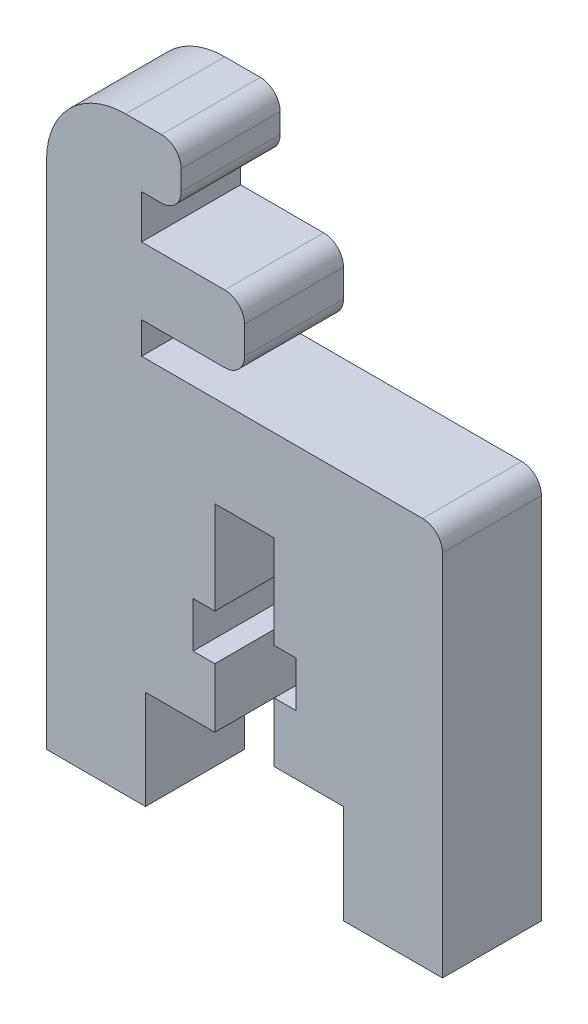
ISO-10303-21;
HEADER;
FILE_DESCRIPTION(('STEP AP214'),'2;1');
FILE_NAME('part.step','',(''),(''),'','','');
FILE_SCHEMA(('AUTOMOTIVE_DESIGN { 1 0 10303 214 1 1 1 1 }'));
ENDSEC;
DATA;
#1=APPLICATION_CONTEXT('core data for automotive mechanical design processes');
#2=APPLICATION_PROTOCOL_DEFINITION('international standard','automotive_design',2000,#1);
#3=PRODUCT_CONTEXT('',#1,'mechanical');
#4=PRODUCT('Part','Part','',(#3));
#5=PRODUCT_RELATED_PRODUCT_CATEGORY('part','',(#4));
#6=PRODUCT_DEFINITION_FORMATION('','',#4);
#7=PRODUCT_DEFINITION_CONTEXT('part definition',#1,'design');
#8=PRODUCT_DEFINITION('design','',#6,#7);
#9=PRODUCT_DEFINITION_SHAPE('','',#8);
#10=(LENGTH_UNIT() NAMED_UNIT(*) SI_UNIT(.MILLI.,.METRE.));
#11=(NAMED_UNIT(*) PLANE_ANGLE_UNIT() SI_UNIT($,.RADIAN.));
#12=(NAMED_UNIT(*) SI_UNIT($,.STERADIAN.) SOLID_ANGLE_UNIT());
#13=UNCERTAINTY_MEASURE_WITH_UNIT(LENGTH_MEASURE(1.E-05),#10,'distance_accuracy_value','');
#14=(GEOMETRIC_REPRESENTATION_CONTEXT(3) GLOBAL_UNCERTAINTY_ASSIGNED_CONTEXT((#13)) GLOBAL_UNIT_ASSIGNED_CONTEXT((#10,
#11,#12)) REPRESENTATION_CONTEXT('',''));
#15=CARTESIAN_POINT('',(0.,0.,0.));
#16=DIRECTION('',(0.,0.,1.));
#17=DIRECTION('',(1.,0.,0.));
#18=AXIS2_PLACEMENT_3D('',#15,#16,#17);
#19=CARTESIAN_POINT('',(5.,0.,5.));
#20=DIRECTION('',(0.,1.,0.));
#21=DIRECTION('',(0.,0.,1.));
#22=AXIS2_PLACEMENT_3D('',#19,#20,#21);
#23=PLANE('',#22);
#24=DIRECTION('',(1.,0.,0.));
#25=VECTOR('',#24,1.);
#26=CARTESIAN_POINT('',(5.,0.,0.));
#27=LINE('',#26,#25);
#28=CARTESIAN_POINT('',(0.,0.,0.));
#29=VERTEX_POINT('',#28);
#30=CARTESIAN_POINT('',(5.,0.,0.));
#31=VERTEX_POINT('',#30);
#32=EDGE_CURVE('E330',#29,#31,#27,.T.);
#33=ORIENTED_EDGE('',*,*,#32,.T.);
#34=DIRECTION('',(0.,0.,-1.));
#35=VECTOR('',#34,1.);
#36=CARTESIAN_POINT('',(5.,0.,5.));
#37=LINE('',#36,#35);
#38=CARTESIAN_POINT('',(5.,0.,5.));
#39=VERTEX_POINT('',#38);
#40=EDGE_CURVE('E269',#39,#31,#37,.T.);
#41=ORIENTED_EDGE('',*,*,#40,.F.);
#42=DIRECTION('',(1.,0.,0.));
#43=VECTOR('',#42,1.);
#44=CARTESIAN_POINT('',(5.,0.,5.));
#45=LINE('',#44,#43);
#46=CARTESIAN_POINT('',(0.,0.,5.));
#47=VERTEX_POINT('',#46);
#48=EDGE_CURVE('E256',#47,#39,#45,.T.);
#49=ORIENTED_EDGE('',*,*,#48,.F.);
#50=DIRECTION('',(0.,0.,-1.));
#51=VECTOR('',#50,1.);
#52=CARTESIAN_POINT('',(0.,0.,5.));
#53=LINE('',#52,#51);
#54=EDGE_CURVE('E267',#47,#29,#53,.T.);
#55=ORIENTED_EDGE('',*,*,#54,.T.);
#56=EDGE_LOOP('',(#33,#41,#49,#55));
#57=FACE_BOUND('',#56,.T.);
#58=ADVANCED_FACE('F33',(#57),#23,.F.);
#59=CARTESIAN_POINT('',(5.,0.,5.));
#60=DIRECTION('',(-1.,0.,0.));
#61=DIRECTION('',(0.,-1.,0.));
#62=AXIS2_PLACEMENT_3D('',#59,#60,#61);
#63=PLANE('',#62);
#64=DIRECTION('',(0.,1.,0.));
#65=VECTOR('',#64,1.);
#66=CARTESIAN_POINT('',(5.,0.,0.));
#67=LINE('',#66,#65);
#68=CARTESIAN_POINT('',(5.,5.,0.));
#69=VERTEX_POINT('',#68);
#70=EDGE_CURVE('E405',#31,#69,#67,.T.);
#71=ORIENTED_EDGE('',*,*,#70,.T.);
#72=DIRECTION('',(0.,0.,-1.));
#73=VECTOR('',#72,1.);
#74=CARTESIAN_POINT('',(5.,5.,5.));
#75=LINE('',#74,#73);
#76=CARTESIAN_POINT('',(5.,5.,5.));
#77=VERTEX_POINT('',#76);
#78=EDGE_CURVE('E280',#77,#69,#75,.T.);
#79=ORIENTED_EDGE('',*,*,#78,.F.);
#80=DIRECTION('',(0.,1.,0.));
#81=VECTOR('',#80,1.);
#82=CARTESIAN_POINT('',(5.,0.,5.));
#83=LINE('',#82,#81);
#84=EDGE_CURVE('E271',#39,#77,#83,.T.);
#85=ORIENTED_EDGE('',*,*,#84,.F.);
#86=ORIENTED_EDGE('',*,*,#40,.T.);
#87=EDGE_LOOP('',(#71,#79,#85,#86));
#88=FACE_BOUND('',#87,.T.);
#89=ADVANCED_FACE('F477',(#88),#63,.F.);
#90=CARTESIAN_POINT('',(8.50000000000001,5.,5.));
#91=DIRECTION('',(0.,1.,0.));
#92=DIRECTION('',(-1.,0.,0.));
#93=AXIS2_PLACEMENT_3D('',#90,#91,#92);
#94=PLANE('',#93);
#95=DIRECTION('',(1.,0.,0.));
#96=VECTOR('',#95,1.);
#97=CARTESIAN_POINT('',(8.50000000000001,5.,0.));
#98=LINE('',#97,#96);
#99=CARTESIAN_POINT('',(8.50000000000001,5.,0.));
#100=VERTEX_POINT('',#99);
#101=EDGE_CURVE('E401',#69,#100,#98,.T.);
#102=ORIENTED_EDGE('',*,*,#101,.T.);
#103=DIRECTION('',(0.,0.,-1.));
#104=VECTOR('',#103,1.);
#105=CARTESIAN_POINT('',(8.50000000000001,5.,5.));
#106=LINE('',#105,#104);
#107=CARTESIAN_POINT('',(8.50000000000001,5.,5.));
#108=VERTEX_POINT('',#107);
#109=EDGE_CURVE('E392',#108,#100,#106,.T.);
#110=ORIENTED_EDGE('',*,*,#109,.F.);
#111=DIRECTION('',(1.,0.,0.));
#112=VECTOR('',#111,1.);
#113=CARTESIAN_POINT('',(8.50000000000001,5.,5.));
#114=LINE('',#113,#112);
#115=EDGE_CURVE('E402',#77,#108,#114,.T.);
#116=ORIENTED_EDGE('',*,*,#115,.F.);
#117=ORIENTED_EDGE('',*,*,#78,.T.);
#118=EDGE_LOOP('',(#102,#110,#116,#117));
#119=FACE_BOUND('',#118,.T.);
#120=ADVANCED_FACE('F399',(#119),#94,.F.);
#121=CARTESIAN_POINT('',(8.5,8.,5.));
#122=DIRECTION('',(-1.,0.,0.));
#123=DIRECTION('',(0.,-1.,0.));
#124=AXIS2_PLACEMENT_3D('',#121,#122,#123);
#125=PLANE('',#124);
#126=DIRECTION('',(0.,1.,0.));
#127=VECTOR('',#126,1.);
#128=CARTESIAN_POINT('',(8.5,8.,0.));
#129=LINE('',#128,#127);
#130=CARTESIAN_POINT('',(8.5,8.,0.));
#131=VERTEX_POINT('',#130);
#132=EDGE_CURVE('E407',#100,#131,#129,.T.);
#133=ORIENTED_EDGE('',*,*,#132,.T.);
#134=DIRECTION('',(0.,0.,-1.));
#135=VECTOR('',#134,1.);
#136=CARTESIAN_POINT('',(8.5,8.,5.));
#137=LINE('',#136,#135);
#138=CARTESIAN_POINT('',(8.5,8.,5.));
#139=VERTEX_POINT('',#138);
#140=EDGE_CURVE('E389',#139,#131,#137,.T.);
#141=ORIENTED_EDGE('',*,*,#140,.F.);
#142=DIRECTION('',(0.,1.,0.));
#143=VECTOR('',#142,1.);
#144=CARTESIAN_POINT('',(8.5,8.,5.));
#145=LINE('',#144,#143);
#146=EDGE_CURVE('E479',#108,#139,#145,.T.);
#147=ORIENTED_EDGE('',*,*,#146,.F.);
#148=ORIENTED_EDGE('',*,*,#109,.T.);
#149=EDGE_LOOP('',(#133,#141,#147,#148));
#150=FACE_BOUND('',#149,.T.);
#151=ADVANCED_FACE('F647',(#150),#125,.F.);
#152=CARTESIAN_POINT('',(8.5,8.,5.));
#153=DIRECTION('',(0.,-1.,0.));
#154=DIRECTION('',(1.,0.,0.));
#155=AXIS2_PLACEMENT_3D('',#152,#153,#154);
#156=PLANE('',#155);
#157=DIRECTION('',(-1.,0.,0.));
#158=VECTOR('',#157,1.);
#159=CARTESIAN_POINT('',(8.5,8.,0.));
#160=LINE('',#159,#158);
#161=CARTESIAN_POINT('',(7.4,8.00000000000001,0.));
#162=VERTEX_POINT('',#161);
#163=EDGE_CURVE('E409',#131,#162,#160,.T.);
#164=ORIENTED_EDGE('',*,*,#163,.T.);
#165=DIRECTION('',(0.,0.,-1.));
#166=VECTOR('',#165,1.);
#167=CARTESIAN_POINT('',(7.4,8.00000000000001,5.));
#168=LINE('',#167,#166);
#169=CARTESIAN_POINT('',(7.4,8.00000000000001,5.));
#170=VERTEX_POINT('',#169);
#171=EDGE_CURVE('E386',#170,#162,#168,.T.);
#172=ORIENTED_EDGE('',*,*,#171,.F.);
#173=DIRECTION('',(-1.,0.,0.));
#174=VECTOR('',#173,1.);
#175=CARTESIAN_POINT('',(8.5,8.,5.));
#176=LINE('',#175,#174);
#177=EDGE_CURVE('E483',#139,#170,#176,.T.);
#178=ORIENTED_EDGE('',*,*,#177,.F.);
#179=ORIENTED_EDGE('',*,*,#140,.T.);
#180=EDGE_LOOP('',(#164,#172,#178,#179));
#181=FACE_BOUND('',#180,.T.);
#182=ADVANCED_FACE('F643',(#181),#156,.F.);
#183=CARTESIAN_POINT('',(7.4,8.00000000000001,5.));
#184=DIRECTION('',(-1.,0.,0.));
#185=DIRECTION('',(0.,-1.,0.));
#186=AXIS2_PLACEMENT_3D('',#183,#184,#185);
#187=PLANE('',#186);
#188=DIRECTION('',(0.,1.,0.));
#189=VECTOR('',#188,1.);
#190=CARTESIAN_POINT('',(7.4,8.00000000000001,0.));
#191=LINE('',#190,#189);
#192=CARTESIAN_POINT('',(7.4,10.3,0.));
#193=VERTEX_POINT('',#192);
#194=EDGE_CURVE('E415',#162,#193,#191,.T.);
#195=ORIENTED_EDGE('',*,*,#194,.T.);
#196=DIRECTION('',(0.,0.,-1.));
#197=VECTOR('',#196,1.);
#198=CARTESIAN_POINT('',(7.4,10.3,5.));
#199=LINE('',#198,#197);
#200=CARTESIAN_POINT('',(7.4,10.3,5.));
#201=VERTEX_POINT('',#200);
#202=EDGE_CURVE('E383',#201,#193,#199,.T.);
#203=ORIENTED_EDGE('',*,*,#202,.F.);
#204=DIRECTION('',(0.,1.,0.));
#205=VECTOR('',#204,1.);
#206=CARTESIAN_POINT('',(7.4,8.00000000000001,5.));
#207=LINE('',#206,#205);
#208=EDGE_CURVE('E485',#170,#201,#207,.T.);
#209=ORIENTED_EDGE('',*,*,#208,.F.);
#210=ORIENTED_EDGE('',*,*,#171,.T.);
#211=EDGE_LOOP('',(#195,#203,#209,#210));
#212=FACE_BOUND('',#211,.T.);
#213=ADVANCED_FACE('F639',(#212),#187,.F.);
#214=CARTESIAN_POINT('',(7.4,10.3,5.));
#215=DIRECTION('',(0.,1.,0.));
#216=DIRECTION('',(-1.,0.,0.));
#217=AXIS2_PLACEMENT_3D('',#214,#215,#216);
#218=PLANE('',#217);
#219=DIRECTION('',(1.,0.,0.));
#220=VECTOR('',#219,1.);
#221=CARTESIAN_POINT('',(7.4,10.3,0.));
#222=LINE('',#221,#220);
#223=CARTESIAN_POINT('',(8.5,10.3,0.));
#224=VERTEX_POINT('',#223);
#225=EDGE_CURVE('E417',#193,#224,#222,.T.);
#226=ORIENTED_EDGE('',*,*,#225,.T.);
#227=DIRECTION('',(0.,0.,-1.));
#228=VECTOR('',#227,1.);
#229=CARTESIAN_POINT('',(8.5,10.3,5.));
#230=LINE('',#229,#228);
#231=CARTESIAN_POINT('',(8.5,10.3,5.));
#232=VERTEX_POINT('',#231);
#233=EDGE_CURVE('E380',#232,#224,#230,.T.);
#234=ORIENTED_EDGE('',*,*,#233,.F.);
#235=DIRECTION('',(1.,0.,0.));
#236=VECTOR('',#235,1.);
#237=CARTESIAN_POINT('',(7.4,10.3,5.));
#238=LINE('',#237,#236);
#239=EDGE_CURVE('E487',#201,#232,#238,.T.);
#240=ORIENTED_EDGE('',*,*,#239,.F.);
#241=ORIENTED_EDGE('',*,*,#202,.T.);
#242=EDGE_LOOP('',(#226,#234,#240,#241));
#243=FACE_BOUND('',#242,.T.);
#244=ADVANCED_FACE('F634',(#243),#218,.F.);
#245=CARTESIAN_POINT('',(8.5,15.,5.));
#246=DIRECTION('',(-1.,0.,0.));
#247=DIRECTION('',(0.,-1.,0.));
#248=AXIS2_PLACEMENT_3D('',#245,#246,#247);
#249=PLANE('',#248);
#250=DIRECTION('',(0.,1.,0.));
#251=VECTOR('',#250,1.);
#252=CARTESIAN_POINT('',(8.5,15.,0.));
#253=LINE('',#252,#251);
#254=CARTESIAN_POINT('',(8.5,15.,0.));
#255=VERTEX_POINT('',#254);
#256=EDGE_CURVE('E419',#224,#255,#253,.T.);
#257=ORIENTED_EDGE('',*,*,#256,.T.);
#258=DIRECTION('',(0.,0.,-1.));
#259=VECTOR('',#258,1.);
#260=CARTESIAN_POINT('',(8.5,15.,5.));
#261=LINE('',#260,#259);
#262=CARTESIAN_POINT('',(8.5,15.,5.));
#263=VERTEX_POINT('',#262);
#264=EDGE_CURVE('E377',#263,#255,#261,.T.);
#265=ORIENTED_EDGE('',*,*,#264,.F.);
#266=DIRECTION('',(0.,1.,0.));
#267=VECTOR('',#266,1.);
#268=CARTESIAN_POINT('',(8.5,15.,5.));
#269=LINE('',#268,#267);
#270=EDGE_CURVE('E489',#232,#263,#269,.T.);
#271=ORIENTED_EDGE('',*,*,#270,.F.);
#272=ORIENTED_EDGE('',*,*,#233,.T.);
#273=EDGE_LOOP('',(#257,#265,#271,#272));
#274=FACE_BOUND('',#273,.T.);
#275=ADVANCED_FACE('F629',(#274),#249,.F.);
#276=CARTESIAN_POINT('',(11.5,15.,5.));
#277=DIRECTION('',(0.,1.,0.));
#278=DIRECTION('',(0.,0.,1.));
#279=AXIS2_PLACEMENT_3D('',#276,#277,#278);
#280=PLANE('',#279);
#281=DIRECTION('',(1.,0.,0.));
#282=VECTOR('',#281,1.);
#283=CARTESIAN_POINT('',(11.5,15.,0.));
#284=LINE('',#283,#282);
#285=CARTESIAN_POINT('',(11.5,15.,0.));
#286=VERTEX_POINT('',#285);
#287=EDGE_CURVE('E421',#255,#286,#284,.T.);
#288=ORIENTED_EDGE('',*,*,#287,.T.);
#289=DIRECTION('',(0.,0.,-1.));
#290=VECTOR('',#289,1.);
#291=CARTESIAN_POINT('',(11.5,15.,5.));
#292=LINE('',#291,#290);
#293=CARTESIAN_POINT('',(11.5,15.,5.));
#294=VERTEX_POINT('',#293);
#295=EDGE_CURVE('E374',#294,#286,#292,.T.);
#296=ORIENTED_EDGE('',*,*,#295,.F.);
#297=DIRECTION('',(1.,0.,0.));
#298=VECTOR('',#297,1.);
#299=CARTESIAN_POINT('',(11.5,15.,5.));
#300=LINE('',#299,#298);
#301=EDGE_CURVE('E491',#263,#294,#300,.T.);
#302=ORIENTED_EDGE('',*,*,#301,.F.);
#303=ORIENTED_EDGE('',*,*,#264,.T.);
#304=EDGE_LOOP('',(#288,#296,#302,#303));
#305=FACE_BOUND('',#304,.T.);
#306=ADVANCED_FACE('F625',(#305),#280,.F.);
#307=CARTESIAN_POINT('',(11.5,10.3,5.));
#308=DIRECTION('',(1.,0.,0.));
#309=DIRECTION('',(0.,0.,-1.));
#310=AXIS2_PLACEMENT_3D('',#307,#308,#309);
#311=PLANE('',#310);
#312=DIRECTION('',(0.,-1.,0.));
#313=VECTOR('',#312,1.);
#314=CARTESIAN_POINT('',(11.5,10.3,0.));
#315=LINE('',#314,#313);
#316=CARTESIAN_POINT('',(11.5,10.3,0.));
#317=VERTEX_POINT('',#316);
#318=EDGE_CURVE('E423',#286,#317,#315,.T.);
#319=ORIENTED_EDGE('',*,*,#318,.T.);
#320=DIRECTION('',(0.,0.,-1.));
#321=VECTOR('',#320,1.);
#322=CARTESIAN_POINT('',(11.5,10.3,5.));
#323=LINE('',#322,#321);
#324=CARTESIAN_POINT('',(11.5,10.3,5.));
#325=VERTEX_POINT('',#324);
#326=EDGE_CURVE('E371',#325,#317,#323,.T.);
#327=ORIENTED_EDGE('',*,*,#326,.F.);
#328=DIRECTION('',(0.,-1.,0.));
#329=VECTOR('',#328,1.);
#330=CARTESIAN_POINT('',(11.5,10.3,5.));
#331=LINE('',#330,#329);
#332=EDGE_CURVE('E493',#294,#325,#331,.T.);
#333=ORIENTED_EDGE('',*,*,#332,.F.);
#334=ORIENTED_EDGE('',*,*,#295,.T.);
#335=EDGE_LOOP('',(#319,#327,#333,#334));
#336=FACE_BOUND('',#335,.T.);
#337=ADVANCED_FACE('F620',(#336),#311,.F.);
#338=CARTESIAN_POINT('',(11.5,10.3,5.));
#339=DIRECTION('',(0.,1.,0.));
#340=DIRECTION('',(-1.,0.,0.));
#341=AXIS2_PLACEMENT_3D('',#338,#339,#340);
#342=PLANE('',#341);
#343=DIRECTION('',(1.,0.,0.));
#344=VECTOR('',#343,1.);
#345=CARTESIAN_POINT('',(11.5,10.3,0.));
#346=LINE('',#345,#344);
#347=CARTESIAN_POINT('',(12.6,10.3,0.));
#348=VERTEX_POINT('',#347);
#349=EDGE_CURVE('E425',#317,#348,#346,.T.);
#350=ORIENTED_EDGE('',*,*,#349,.T.);
#351=DIRECTION('',(0.,0.,-1.));
#352=VECTOR('',#351,1.);
#353=CARTESIAN_POINT('',(12.6,10.3,5.));
#354=LINE('',#353,#352);
#355=CARTESIAN_POINT('',(12.6,10.3,5.));
#356=VERTEX_POINT('',#355);
#357=EDGE_CURVE('E368',#356,#348,#354,.T.);
#358=ORIENTED_EDGE('',*,*,#357,.F.);
#359=DIRECTION('',(1.,0.,0.));
#360=VECTOR('',#359,1.);
#361=CARTESIAN_POINT('',(11.5,10.3,5.));
#362=LINE('',#361,#360);
#363=EDGE_CURVE('E495',#325,#356,#362,.T.);
#364=ORIENTED_EDGE('',*,*,#363,.F.);
#365=ORIENTED_EDGE('',*,*,#326,.T.);
#366=EDGE_LOOP('',(#350,#358,#364,#365));
#367=FACE_BOUND('',#366,.T.);
#368=ADVANCED_FACE('F614',(#367),#342,.F.);
#369=CARTESIAN_POINT('',(12.6,10.3,5.));
#370=DIRECTION('',(1.,0.,0.));
#371=DIRECTION('',(0.,1.,0.));
#372=AXIS2_PLACEMENT_3D('',#369,#370,#371);
#373=PLANE('',#372);
#374=DIRECTION('',(0.,-1.,0.));
#375=VECTOR('',#374,1.);
#376=CARTESIAN_POINT('',(12.6,10.3,0.));
#377=LINE('',#376,#375);
#378=CARTESIAN_POINT('',(12.6,8.,0.));
#379=VERTEX_POINT('',#378);
#380=EDGE_CURVE('E427',#348,#379,#377,.T.);
#381=ORIENTED_EDGE('',*,*,#380,.T.);
#382=DIRECTION('',(0.,0.,-1.));
#383=VECTOR('',#382,1.);
#384=CARTESIAN_POINT('',(12.6,8.,5.));
#385=LINE('',#384,#383);
#386=CARTESIAN_POINT('',(12.6,8.,5.));
#387=VERTEX_POINT('',#386);
#388=EDGE_CURVE('E365',#387,#379,#385,.T.);
#389=ORIENTED_EDGE('',*,*,#388,.F.);
#390=DIRECTION('',(0.,-1.,0.));
#391=VECTOR('',#390,1.);
#392=CARTESIAN_POINT('',(12.6,10.3,5.));
#393=LINE('',#392,#391);
#394=EDGE_CURVE('E497',#356,#387,#393,.T.);
#395=ORIENTED_EDGE('',*,*,#394,.F.);
#396=ORIENTED_EDGE('',*,*,#357,.T.);
#397=EDGE_LOOP('',(#381,#389,#395,#396));
#398=FACE_BOUND('',#397,.T.);
#399=ADVANCED_FACE('F610',(#398),#373,.F.);
#400=CARTESIAN_POINT('',(12.6,8.,5.));
#401=DIRECTION('',(0.,-1.,0.));
#402=DIRECTION('',(0.,0.,-1.));
#403=AXIS2_PLACEMENT_3D('',#400,#401,#402);
#404=PLANE('',#403);
#405=DIRECTION('',(-1.,0.,0.));
#406=VECTOR('',#405,1.);
#407=CARTESIAN_POINT('',(12.6,8.,0.));
#408=LINE('',#407,#406);
#409=CARTESIAN_POINT('',(11.5,8.,0.));
#410=VERTEX_POINT('',#409);
#411=EDGE_CURVE('E429',#379,#410,#408,.T.);
#412=ORIENTED_EDGE('',*,*,#411,.T.);
#413=DIRECTION('',(0.,0.,-1.));
#414=VECTOR('',#413,1.);
#415=CARTESIAN_POINT('',(11.5,8.,5.));
#416=LINE('',#415,#414);
#417=CARTESIAN_POINT('',(11.5,8.,5.));
#418=VERTEX_POINT('',#417);
#419=EDGE_CURVE('E362',#418,#410,#416,.T.);
#420=ORIENTED_EDGE('',*,*,#419,.F.);
#421=DIRECTION('',(-1.,0.,0.));
#422=VECTOR('',#421,1.);
#423=CARTESIAN_POINT('',(12.6,8.,5.));
#424=LINE('',#423,#422);
#425=EDGE_CURVE('E499',#387,#418,#424,.T.);
#426=ORIENTED_EDGE('',*,*,#425,.F.);
#427=ORIENTED_EDGE('',*,*,#388,.T.);
#428=EDGE_LOOP('',(#412,#420,#426,#427));
#429=FACE_BOUND('',#428,.T.);
#430=ADVANCED_FACE('F605',(#429),#404,.F.);
#431=CARTESIAN_POINT('',(11.5,5.,5.));
#432=DIRECTION('',(1.,0.,0.));
#433=DIRECTION('',(0.,1.,0.));
#434=AXIS2_PLACEMENT_3D('',#431,#432,#433);
#435=PLANE('',#434);
#436=DIRECTION('',(0.,-1.,0.));
#437=VECTOR('',#436,1.);
#438=CARTESIAN_POINT('',(11.5,5.,0.));
#439=LINE('',#438,#437);
#440=CARTESIAN_POINT('',(11.5,5.,0.));
#441=VERTEX_POINT('',#440);
#442=EDGE_CURVE('E431',#410,#441,#439,.T.);
#443=ORIENTED_EDGE('',*,*,#442,.T.);
#444=DIRECTION('',(0.,0.,-1.));
#445=VECTOR('',#444,1.);
#446=CARTESIAN_POINT('',(11.5,5.,5.));
#447=LINE('',#446,#445);
#448=CARTESIAN_POINT('',(11.5,5.,5.));
#449=VERTEX_POINT('',#448);
#450=EDGE_CURVE('E359',#449,#441,#447,.T.);
#451=ORIENTED_EDGE('',*,*,#450,.F.);
#452=DIRECTION('',(0.,-1.,0.));
#453=VECTOR('',#452,1.);
#454=CARTESIAN_POINT('',(11.5,5.,5.));
#455=LINE('',#454,#453);
#456=EDGE_CURVE('E501',#418,#449,#455,.T.);
#457=ORIENTED_EDGE('',*,*,#456,.F.);
#458=ORIENTED_EDGE('',*,*,#419,.T.);
#459=EDGE_LOOP('',(#443,#451,#457,#458));
#460=FACE_BOUND('',#459,.T.);
#461=ADVANCED_FACE('F599',(#460),#435,.F.);
#462=CARTESIAN_POINT('',(11.5,5.,5.));
#463=DIRECTION('',(0.,1.,0.));
#464=DIRECTION('',(0.,0.,1.));
#465=AXIS2_PLACEMENT_3D('',#462,#463,#464);
#466=PLANE('',#465);
#467=DIRECTION('',(1.,0.,0.));
#468=VECTOR('',#467,1.);
#469=CARTESIAN_POINT('',(11.5,5.,0.));
#470=LINE('',#469,#468);
#471=CARTESIAN_POINT('',(15.,5.,0.));
#472=VERTEX_POINT('',#471);
#473=EDGE_CURVE('E433',#441,#472,#470,.T.);
#474=ORIENTED_EDGE('',*,*,#473,.T.);
#475=DIRECTION('',(0.,0.,-1.));
#476=VECTOR('',#475,1.);
#477=CARTESIAN_POINT('',(15.,5.,5.));
#478=LINE('',#477,#476);
#479=CARTESIAN_POINT('',(15.,5.,5.));
#480=VERTEX_POINT('',#479);
#481=EDGE_CURVE('E356',#480,#472,#478,.T.);
#482=ORIENTED_EDGE('',*,*,#481,.F.);
#483=DIRECTION('',(1.,0.,0.));
#484=VECTOR('',#483,1.);
#485=CARTESIAN_POINT('',(11.5,5.,5.));
#486=LINE('',#485,#484);
#487=EDGE_CURVE('E503',#449,#480,#486,.T.);
#488=ORIENTED_EDGE('',*,*,#487,.F.);
#489=ORIENTED_EDGE('',*,*,#450,.T.);
#490=EDGE_LOOP('',(#474,#482,#488,#489));
#491=FACE_BOUND('',#490,.T.);
#492=ADVANCED_FACE('F595',(#491),#466,.F.);
#493=CARTESIAN_POINT('',(15.,5.,5.));
#494=DIRECTION('',(1.,0.,0.));
#495=DIRECTION('',(0.,0.,-1.));
#496=AXIS2_PLACEMENT_3D('',#493,#494,#495);
#497=PLANE('',#496);
#498=DIRECTION('',(0.,-1.,0.));
#499=VECTOR('',#498,1.);
#500=CARTESIAN_POINT('',(15.,5.,0.));
#501=LINE('',#500,#499);
#502=CARTESIAN_POINT('',(15.,0.,0.));
#503=VERTEX_POINT('',#502);
#504=EDGE_CURVE('E435',#472,#503,#501,.T.);
#505=ORIENTED_EDGE('',*,*,#504,.T.);
#506=DIRECTION('',(0.,0.,-1.));
#507=VECTOR('',#506,1.);
#508=CARTESIAN_POINT('',(15.,0.,5.));
#509=LINE('',#508,#507);
#510=CARTESIAN_POINT('',(15.,0.,5.));
#511=VERTEX_POINT('',#510);
#512=EDGE_CURVE('E353',#511,#503,#509,.T.);
#513=ORIENTED_EDGE('',*,*,#512,.F.);
#514=DIRECTION('',(0.,-1.,0.));
#515=VECTOR('',#514,1.);
#516=CARTESIAN_POINT('',(15.,5.,5.));
#517=LINE('',#516,#515);
#518=EDGE_CURVE('E505',#480,#511,#517,.T.);
#519=ORIENTED_EDGE('',*,*,#518,.F.);
#520=ORIENTED_EDGE('',*,*,#481,.T.);
#521=EDGE_LOOP('',(#505,#513,#519,#520));
#522=FACE_BOUND('',#521,.T.);
#523=ADVANCED_FACE('F591',(#522),#497,.F.);
#524=CARTESIAN_POINT('',(15.,0.,5.));
#525=DIRECTION('',(0.,1.,0.));
#526=DIRECTION('',(0.,0.,1.));
#527=AXIS2_PLACEMENT_3D('',#524,#525,#526);
#528=PLANE('',#527);
#529=DIRECTION('',(1.,0.,0.));
#530=VECTOR('',#529,1.);
#531=CARTESIAN_POINT('',(15.,0.,0.));
#532=LINE('',#531,#530);
#533=CARTESIAN_POINT('',(20.,0.,0.));
#534=VERTEX_POINT('',#533);
#535=EDGE_CURVE('E437',#503,#534,#532,.T.);
#536=ORIENTED_EDGE('',*,*,#535,.T.);
#537=DIRECTION('',(0.,0.,-1.));
#538=VECTOR('',#537,1.);
#539=CARTESIAN_POINT('',(20.,0.,5.));
#540=LINE('',#539,#538);
#541=CARTESIAN_POINT('',(20.,0.,5.));
#542=VERTEX_POINT('',#541);
#543=EDGE_CURVE('E350',#542,#534,#540,.T.);
#544=ORIENTED_EDGE('',*,*,#543,.F.);
#545=DIRECTION('',(1.,0.,0.));
#546=VECTOR('',#545,1.);
#547=CARTESIAN_POINT('',(15.,0.,5.));
#548=LINE('',#547,#546);
#549=EDGE_CURVE('E507',#511,#542,#548,.T.);
#550=ORIENTED_EDGE('',*,*,#549,.F.);
#551=ORIENTED_EDGE('',*,*,#512,.T.);
#552=EDGE_LOOP('',(#536,#544,#550,#551));
#553=FACE_BOUND('',#552,.T.);
#554=ADVANCED_FACE('F585',(#553),#528,.F.);
#555=CARTESIAN_POINT('',(20.,5.,5.));
#556=DIRECTION('',(-1.,0.,0.));
#557=DIRECTION('',(0.,0.,1.));
#558=AXIS2_PLACEMENT_3D('',#555,#556,#557);
#559=PLANE('',#558);
#560=DIRECTION('',(0.,1.,0.));
#561=VECTOR('',#560,1.);
#562=CARTESIAN_POINT('',(20.,5.,0.));
#563=LINE('',#562,#561);
#564=CARTESIAN_POINT('',(20.,18.6,0.));
#565=VERTEX_POINT('',#564);
#566=EDGE_CURVE('E440',#534,#565,#563,.T.);
#567=ORIENTED_EDGE('',*,*,#566,.T.);
#568=DIRECTION('',(0.,0.,-1.));
#569=VECTOR('',#568,1.);
#570=CARTESIAN_POINT('',(20.,18.6,5.));
#571=LINE('',#570,#569);
#572=CARTESIAN_POINT('',(20.,18.6,5.));
#573=VERTEX_POINT('',#572);
#574=EDGE_CURVE('E287',#565,#573,#571,.F.);
#575=ORIENTED_EDGE('',*,*,#574,.T.);
#576=DIRECTION('',(0.,1.,0.));
#577=VECTOR('',#576,1.);
#578=CARTESIAN_POINT('',(20.,0.,5.));
#579=LINE('',#578,#577);
#580=EDGE_CURVE('E509',#542,#573,#579,.T.);
#581=ORIENTED_EDGE('',*,*,#580,.F.);
#582=ORIENTED_EDGE('',*,*,#543,.T.);
#583=EDGE_LOOP('',(#567,#575,#581,#582));
#584=FACE_BOUND('',#583,.T.);
#585=ADVANCED_FACE('F579',(#584),#559,.F.);
#586=CARTESIAN_POINT('',(20.,19.6,5.));
#587=DIRECTION('',(0.,-1.,0.));
#588=DIRECTION('',(1.,0.,0.));
#589=AXIS2_PLACEMENT_3D('',#586,#587,#588);
#590=PLANE('',#589);
#591=DIRECTION('',(-1.,0.,0.));
#592=VECTOR('',#591,1.);
#593=CARTESIAN_POINT('',(20.,19.6,5.));
#594=LINE('',#593,#592);
#595=CARTESIAN_POINT('',(19.,19.6,5.));
#596=VERTEX_POINT('',#595);
#597=CARTESIAN_POINT('',(4.8,19.6,5.));
#598=VERTEX_POINT('',#597);
#599=EDGE_CURVE('E512',#596,#598,#594,.T.);
#600=ORIENTED_EDGE('',*,*,#599,.F.);
#601=DIRECTION('',(0.,0.,-1.));
#602=VECTOR('',#601,1.);
#603=CARTESIAN_POINT('',(19.,19.6,5.));
#604=LINE('',#603,#602);
#605=CARTESIAN_POINT('',(19.,19.6,0.));
#606=VERTEX_POINT('',#605);
#607=EDGE_CURVE('E275',#596,#606,#604,.T.);
#608=ORIENTED_EDGE('',*,*,#607,.T.);
#609=DIRECTION('',(-1.,0.,0.));
#610=VECTOR('',#609,1.);
#611=CARTESIAN_POINT('',(20.,19.6,0.));
#612=LINE('',#611,#610);
#613=CARTESIAN_POINT('',(4.8,19.6,0.));
#614=VERTEX_POINT('',#613);
#615=EDGE_CURVE('E443',#606,#614,#612,.T.);
#616=ORIENTED_EDGE('',*,*,#615,.T.);
#617=DIRECTION('',(0.,0.,-1.));
#618=VECTOR('',#617,1.);
#619=CARTESIAN_POINT('',(4.8,19.6,5.));
#620=LINE('',#619,#618);
#621=EDGE_CURVE('E347',#598,#614,#620,.T.);
#622=ORIENTED_EDGE('',*,*,#621,.F.);
#623=EDGE_LOOP('',(#600,#608,#616,#622));
#624=FACE_BOUND('',#623,.T.);
#625=ADVANCED_FACE('F571',(#624),#590,.F.);
#626=CARTESIAN_POINT('',(4.8,19.6,5.));
#627=DIRECTION('',(-1.,0.,0.));
#628=DIRECTION('',(0.,0.,1.));
#629=AXIS2_PLACEMENT_3D('',#626,#627,#628);
#630=PLANE('',#629);
#631=DIRECTION('',(0.,1.,0.));
#632=VECTOR('',#631,1.);
#633=CARTESIAN_POINT('',(4.8,19.6,0.));
#634=LINE('',#633,#632);
#635=CARTESIAN_POINT('',(4.8,21.2,0.));
#636=VERTEX_POINT('',#635);
#637=EDGE_CURVE('E445',#614,#636,#634,.T.);
#638=ORIENTED_EDGE('',*,*,#637,.T.);
#639=DIRECTION('',(0.,0.,-1.));
#640=VECTOR('',#639,1.);
#641=CARTESIAN_POINT('',(4.8,21.2,5.));
#642=LINE('',#641,#640);
#643=CARTESIAN_POINT('',(4.8,21.2,5.));
#644=VERTEX_POINT('',#643);
#645=EDGE_CURVE('E344',#644,#636,#642,.T.);
#646=ORIENTED_EDGE('',*,*,#645,.F.);
#647=DIRECTION('',(0.,1.,0.));
#648=VECTOR('',#647,1.);
#649=CARTESIAN_POINT('',(4.8,19.6,5.));
#650=LINE('',#649,#648);
#651=EDGE_CURVE('E514',#598,#644,#650,.T.);
#652=ORIENTED_EDGE('',*,*,#651,.F.);
#653=ORIENTED_EDGE('',*,*,#621,.T.);
#654=EDGE_LOOP('',(#638,#646,#652,#653));
#655=FACE_BOUND('',#654,.T.);
#656=ADVANCED_FACE('F566',(#655),#630,.F.);
#657=CARTESIAN_POINT('',(4.8,21.2,5.));
#658=DIRECTION('',(0.,1.,0.));
#659=DIRECTION('',(-1.,0.,0.));
#660=AXIS2_PLACEMENT_3D('',#657,#658,#659);
#661=PLANE('',#660);
#662=DIRECTION('',(1.,0.,0.));
#663=VECTOR('',#662,1.);
#664=CARTESIAN_POINT('',(4.8,21.2,0.));
#665=LINE('',#664,#663);
#666=CARTESIAN_POINT('',(9.,21.2,0.));
#667=VERTEX_POINT('',#666);
#668=EDGE_CURVE('E447',#636,#667,#665,.T.);
#669=ORIENTED_EDGE('',*,*,#668,.T.);
#670=DIRECTION('',(0.,0.,-1.));
#671=VECTOR('',#670,1.);
#672=CARTESIAN_POINT('',(9.,21.2,5.));
#673=LINE('',#672,#671);
#674=CARTESIAN_POINT('',(9.,21.2,5.));
#675=VERTEX_POINT('',#674);
#676=EDGE_CURVE('E296',#667,#675,#673,.F.);
#677=ORIENTED_EDGE('',*,*,#676,.T.);
#678=DIRECTION('',(1.,0.,0.));
#679=VECTOR('',#678,1.);
#680=CARTESIAN_POINT('',(4.8,21.2,5.));
#681=LINE('',#680,#679);
#682=EDGE_CURVE('E516',#644,#675,#681,.T.);
#683=ORIENTED_EDGE('',*,*,#682,.F.);
#684=ORIENTED_EDGE('',*,*,#645,.T.);
#685=EDGE_LOOP('',(#669,#677,#683,#684));
#686=FACE_BOUND('',#685,.T.);
#687=ADVANCED_FACE('F562',(#686),#661,.F.);
#688=CARTESIAN_POINT('',(10.,21.2,5.));
#689=DIRECTION('',(-1.,0.,0.));
#690=DIRECTION('',(0.,0.,1.));
#691=AXIS2_PLACEMENT_3D('',#688,#689,#690);
#692=PLANE('',#691);
#693=DIRECTION('',(0.,1.,0.));
#694=VECTOR('',#693,1.);
#695=CARTESIAN_POINT('',(10.,21.2,0.));
#696=LINE('',#695,#694);
#697=CARTESIAN_POINT('',(10.,22.2,0.));
#698=VERTEX_POINT('',#697);
#699=CARTESIAN_POINT('',(10.,23.6,0.));
#700=VERTEX_POINT('',#699);
#701=EDGE_CURVE('E450',#698,#700,#696,.T.);
#702=ORIENTED_EDGE('',*,*,#701,.T.);
#703=DIRECTION('',(0.,0.,-1.));
#704=VECTOR('',#703,1.);
#705=CARTESIAN_POINT('',(10.,23.6,5.));
#706=LINE('',#705,#704);
#707=CARTESIAN_POINT('',(10.,23.6,5.));
#708=VERTEX_POINT('',#707);
#709=EDGE_CURVE('E323',#700,#708,#706,.F.);
#710=ORIENTED_EDGE('',*,*,#709,.T.);
#711=DIRECTION('',(0.,1.,0.));
#712=VECTOR('',#711,1.);
#713=CARTESIAN_POINT('',(10.,21.2,5.));
#714=LINE('',#713,#712);
#715=CARTESIAN_POINT('',(10.,22.2,5.));
#716=VERTEX_POINT('',#715);
#717=EDGE_CURVE('E519',#716,#708,#714,.T.);
#718=ORIENTED_EDGE('',*,*,#717,.F.);
#719=DIRECTION('',(0.,0.,-1.));
#720=VECTOR('',#719,1.);
#721=CARTESIAN_POINT('',(10.,22.2,5.));
#722=LINE('',#721,#720);
#723=EDGE_CURVE('E293',#716,#698,#722,.T.);
#724=ORIENTED_EDGE('',*,*,#723,.T.);
#725=EDGE_LOOP('',(#702,#710,#718,#724));
#726=FACE_BOUND('',#725,.T.);
#727=ADVANCED_FACE('F552',(#726),#692,.F.);
#728=CARTESIAN_POINT('',(10.,24.6,5.));
#729=DIRECTION('',(0.,-1.,0.));
#730=DIRECTION('',(0.,0.,-1.));
#731=AXIS2_PLACEMENT_3D('',#728,#729,#730);
#732=PLANE('',#731);
#733=DIRECTION('',(-1.,0.,0.));
#734=VECTOR('',#733,1.);
#735=CARTESIAN_POINT('',(10.,24.6,5.));
#736=LINE('',#735,#734);
#737=CARTESIAN_POINT('',(9.,24.6,5.));
#738=VERTEX_POINT('',#737);
#739=CARTESIAN_POINT('',(4.8,24.6,5.));
#740=VERTEX_POINT('',#739);
#741=EDGE_CURVE('E522',#738,#740,#736,.T.);
#742=ORIENTED_EDGE('',*,*,#741,.F.);
#743=DIRECTION('',(0.,0.,-1.));
#744=VECTOR('',#743,1.);
#745=CARTESIAN_POINT('',(9.,24.6,5.));
#746=LINE('',#745,#744);
#747=CARTESIAN_POINT('',(9.,24.6,0.));
#748=VERTEX_POINT('',#747);
#749=EDGE_CURVE('E320',#738,#748,#746,.T.);
#750=ORIENTED_EDGE('',*,*,#749,.T.);
#751=DIRECTION('',(-1.,0.,0.));
#752=VECTOR('',#751,1.);
#753=CARTESIAN_POINT('',(10.,24.6,0.));
#754=LINE('',#753,#752);
#755=CARTESIAN_POINT('',(4.8,24.6,0.));
#756=VERTEX_POINT('',#755);
#757=EDGE_CURVE('E453',#748,#756,#754,.T.);
#758=ORIENTED_EDGE('',*,*,#757,.T.);
#759=DIRECTION('',(0.,0.,-1.));
#760=VECTOR('',#759,1.);
#761=CARTESIAN_POINT('',(4.8,24.6,5.));
#762=LINE('',#761,#760);
#763=EDGE_CURVE('E340',#740,#756,#762,.T.);
#764=ORIENTED_EDGE('',*,*,#763,.F.);
#765=EDGE_LOOP('',(#742,#750,#758,#764));
#766=FACE_BOUND('',#765,.T.);
#767=ADVANCED_FACE('F544',(#766),#732,.F.);
#768=CARTESIAN_POINT('',(4.8,24.6,5.));
#769=DIRECTION('',(-1.,0.,0.));
#770=DIRECTION('',(0.,0.,1.));
#771=AXIS2_PLACEMENT_3D('',#768,#769,#770);
#772=PLANE('',#771);
#773=DIRECTION('',(0.,1.,0.));
#774=VECTOR('',#773,1.);
#775=CARTESIAN_POINT('',(4.8,24.6,0.));
#776=LINE('',#775,#774);
#777=CARTESIAN_POINT('',(4.8,26.8,0.));
#778=VERTEX_POINT('',#777);
#779=EDGE_CURVE('E455',#756,#778,#776,.T.);
#780=ORIENTED_EDGE('',*,*,#779,.T.);
#781=DIRECTION('',(0.,0.,-1.));
#782=VECTOR('',#781,1.);
#783=CARTESIAN_POINT('',(4.8,26.8,5.));
#784=LINE('',#783,#782);
#785=CARTESIAN_POINT('',(4.8,26.8,5.));
#786=VERTEX_POINT('',#785);
#787=EDGE_CURVE('E337',#786,#778,#784,.T.);
#788=ORIENTED_EDGE('',*,*,#787,.F.);
#789=DIRECTION('',(0.,1.,0.));
#790=VECTOR('',#789,1.);
#791=CARTESIAN_POINT('',(4.8,24.6,5.));
#792=LINE('',#791,#790);
#793=EDGE_CURVE('E524',#740,#786,#792,.T.);
#794=ORIENTED_EDGE('',*,*,#793,.F.);
#795=ORIENTED_EDGE('',*,*,#763,.T.);
#796=EDGE_LOOP('',(#780,#788,#794,#795));
#797=FACE_BOUND('',#796,.T.);
#798=ADVANCED_FACE('F538',(#797),#772,.F.);
#799=CARTESIAN_POINT('',(4.8,26.8,5.));
#800=DIRECTION('',(0.,1.,0.));
#801=DIRECTION('',(0.,0.,1.));
#802=AXIS2_PLACEMENT_3D('',#799,#800,#801);
#803=PLANE('',#802);
#804=DIRECTION('',(1.,0.,0.));
#805=VECTOR('',#804,1.);
#806=CARTESIAN_POINT('',(4.8,26.8,0.));
#807=LINE('',#806,#805);
#808=CARTESIAN_POINT('',(5.8,26.8,0.));
#809=VERTEX_POINT('',#808);
#810=EDGE_CURVE('E457',#778,#809,#807,.T.);
#811=ORIENTED_EDGE('',*,*,#810,.T.);
#812=DIRECTION('',(0.,0.,-1.));
#813=VECTOR('',#812,1.);
#814=CARTESIAN_POINT('',(5.8,26.8,5.));
#815=LINE('',#814,#813);
#816=CARTESIAN_POINT('',(5.8,26.8,5.));
#817=VERTEX_POINT('',#816);
#818=EDGE_CURVE('E318',#809,#817,#815,.F.);
#819=ORIENTED_EDGE('',*,*,#818,.T.);
#820=DIRECTION('',(1.,0.,0.));
#821=VECTOR('',#820,1.);
#822=CARTESIAN_POINT('',(4.8,26.8,5.));
#823=LINE('',#822,#821);
#824=EDGE_CURVE('E474',#786,#817,#823,.T.);
#825=ORIENTED_EDGE('',*,*,#824,.F.);
#826=ORIENTED_EDGE('',*,*,#787,.T.);
#827=EDGE_LOOP('',(#811,#819,#825,#826));
#828=FACE_BOUND('',#827,.T.);
#829=ADVANCED_FACE('F536',(#828),#803,.F.);
#830=CARTESIAN_POINT('',(6.8,26.8,5.));
#831=DIRECTION('',(-1.,0.,0.));
#832=DIRECTION('',(0.,0.,1.));
#833=AXIS2_PLACEMENT_3D('',#830,#831,#832);
#834=PLANE('',#833);
#835=DIRECTION('',(0.,1.,0.));
#836=VECTOR('',#835,1.);
#837=CARTESIAN_POINT('',(6.8,26.8,0.));
#838=LINE('',#837,#836);
#839=CARTESIAN_POINT('',(6.8,27.8,0.));
#840=VERTEX_POINT('',#839);
#841=CARTESIAN_POINT('',(6.8,28.8,0.));
#842=VERTEX_POINT('',#841);
#843=EDGE_CURVE('E333',#840,#842,#838,.T.);
#844=ORIENTED_EDGE('',*,*,#843,.T.);
#845=DIRECTION('',(0.,0.,-1.));
#846=VECTOR('',#845,1.);
#847=CARTESIAN_POINT('',(6.8,28.8,5.));
#848=LINE('',#847,#846);
#849=CARTESIAN_POINT('',(6.8,28.8,5.));
#850=VERTEX_POINT('',#849);
#851=EDGE_CURVE('E310',#842,#850,#848,.F.);
#852=ORIENTED_EDGE('',*,*,#851,.T.);
#853=DIRECTION('',(0.,1.,0.));
#854=VECTOR('',#853,1.);
#855=CARTESIAN_POINT('',(6.8,26.8,5.));
#856=LINE('',#855,#854);
#857=CARTESIAN_POINT('',(6.8,27.8,5.));
#858=VERTEX_POINT('',#857);
#859=EDGE_CURVE('E471',#858,#850,#856,.T.);
#860=ORIENTED_EDGE('',*,*,#859,.F.);
#861=DIRECTION('',(0.,0.,-1.));
#862=VECTOR('',#861,1.);
#863=CARTESIAN_POINT('',(6.8,27.8,5.));
#864=LINE('',#863,#862);
#865=EDGE_CURVE('E307',#858,#840,#864,.T.);
#866=ORIENTED_EDGE('',*,*,#865,.T.);
#867=EDGE_LOOP('',(#844,#852,#860,#866));
#868=FACE_BOUND('',#867,.T.);
#869=ADVANCED_FACE('F463',(#868),#834,.F.);
#870=CARTESIAN_POINT('',(6.8,29.8,5.));
#871=DIRECTION('',(0.,-1.,0.));
#872=DIRECTION('',(0.,0.,-1.));
#873=AXIS2_PLACEMENT_3D('',#870,#871,#872);
#874=PLANE('',#873);
#875=DIRECTION('',(-1.,0.,0.));
#876=VECTOR('',#875,1.);
#877=CARTESIAN_POINT('',(6.8,29.8,0.));
#878=LINE('',#877,#876);
#879=CARTESIAN_POINT('',(5.8,29.8,0.));
#880=VERTEX_POINT('',#879);
#881=CARTESIAN_POINT('',(4.,29.8,0.));
#882=VERTEX_POINT('',#881);
#883=EDGE_CURVE('E331',#880,#882,#878,.T.);
#884=ORIENTED_EDGE('',*,*,#883,.T.);
#885=DIRECTION('',(0.,0.,-1.));
#886=VECTOR('',#885,1.);
#887=CARTESIAN_POINT('',(4.,29.8,5.));
#888=LINE('',#887,#886);
#889=CARTESIAN_POINT('',(4.,29.8,5.));
#890=VERTEX_POINT('',#889);
#891=EDGE_CURVE('E41',#882,#890,#888,.F.);
#892=ORIENTED_EDGE('',*,*,#891,.T.);
#893=DIRECTION('',(-1.,0.,0.));
#894=VECTOR('',#893,1.);
#895=CARTESIAN_POINT('',(6.8,29.8,5.));
#896=LINE('',#895,#894);
#897=CARTESIAN_POINT('',(5.8,29.8,5.));
#898=VERTEX_POINT('',#897);
#899=EDGE_CURVE('E341',#898,#890,#896,.T.);
#900=ORIENTED_EDGE('',*,*,#899,.F.);
#901=DIRECTION('',(0.,0.,-1.));
#902=VECTOR('',#901,1.);
#903=CARTESIAN_POINT('',(5.8,29.8,5.));
#904=LINE('',#903,#902);
#905=EDGE_CURVE('E298',#898,#880,#904,.T.);
#906=ORIENTED_EDGE('',*,*,#905,.T.);
#907=EDGE_LOOP('',(#884,#892,#900,#906));
#908=FACE_BOUND('',#907,.T.);
#909=ADVANCED_FACE('F472',(#908),#874,.F.);
#910=CARTESIAN_POINT('',(0.,5.,5.));
#911=DIRECTION('',(1.,0.,0.));
#912=DIRECTION('',(0.,1.,0.));
#913=AXIS2_PLACEMENT_3D('',#910,#911,#912);
#914=PLANE('',#913);
#915=DIRECTION('',(0.,-1.,0.));
#916=VECTOR('',#915,1.);
#917=CARTESIAN_POINT('',(0.,0.,5.));
#918=LINE('',#917,#916);
#919=CARTESIAN_POINT('',(0.,25.8,5.));
#920=VERTEX_POINT('',#919);
#921=EDGE_CURVE('E253',#920,#47,#918,.T.);
#922=ORIENTED_EDGE('',*,*,#921,.F.);
#923=DIRECTION('',(0.,0.,-1.));
#924=VECTOR('',#923,1.);
#925=CARTESIAN_POINT('',(0.,25.8,5.));
#926=LINE('',#925,#924);
#927=CARTESIAN_POINT('',(0.,25.8,0.));
#928=VERTEX_POINT('',#927);
#929=EDGE_CURVE('E325',#920,#928,#926,.T.);
#930=ORIENTED_EDGE('',*,*,#929,.T.);
#931=DIRECTION('',(0.,-1.,0.));
#932=VECTOR('',#931,1.);
#933=CARTESIAN_POINT('',(0.,5.,0.));
#934=LINE('',#933,#932);
#935=EDGE_CURVE('E263',#928,#29,#934,.T.);
#936=ORIENTED_EDGE('',*,*,#935,.T.);
#937=ORIENTED_EDGE('',*,*,#54,.F.);
#938=EDGE_LOOP('',(#922,#930,#936,#937));
#939=FACE_BOUND('',#938,.T.);
#940=ADVANCED_FACE('F273',(#939),#914,.F.);
#941=CARTESIAN_POINT('',(0.,0.,5.));
#942=DIRECTION('',(0.,0.,1.));
#943=DIRECTION('',(1.,0.,0.));
#944=AXIS2_PLACEMENT_3D('',#941,#942,#943);
#945=PLANE('',#944);
#946=ORIENTED_EDGE('',*,*,#899,.T.);
#947=CARTESIAN_POINT('',(4.,25.8,5.));
#948=DIRECTION('',(0.,0.,1.));
#949=DIRECTION('',(1.,0.,0.));
#950=AXIS2_PLACEMENT_3D('',#947,#948,#949);
#951=CIRCLE('',#950,4.);
#952=EDGE_CURVE('E11',#890,#920,#951,.T.);
#953=ORIENTED_EDGE('',*,*,#952,.T.);
#954=ORIENTED_EDGE('',*,*,#921,.T.);
#955=ORIENTED_EDGE('',*,*,#48,.T.);
#956=ORIENTED_EDGE('',*,*,#84,.T.);
#957=ORIENTED_EDGE('',*,*,#115,.T.);
#958=ORIENTED_EDGE('',*,*,#146,.T.);
#959=ORIENTED_EDGE('',*,*,#177,.T.);
#960=ORIENTED_EDGE('',*,*,#208,.T.);
#961=ORIENTED_EDGE('',*,*,#239,.T.);
#962=ORIENTED_EDGE('',*,*,#270,.T.);
#963=ORIENTED_EDGE('',*,*,#301,.T.);
#964=ORIENTED_EDGE('',*,*,#332,.T.);
#965=ORIENTED_EDGE('',*,*,#363,.T.);
#966=ORIENTED_EDGE('',*,*,#394,.T.);
#967=ORIENTED_EDGE('',*,*,#425,.T.);
#968=ORIENTED_EDGE('',*,*,#456,.T.);
#969=ORIENTED_EDGE('',*,*,#487,.T.);
#970=ORIENTED_EDGE('',*,*,#518,.T.);
#971=ORIENTED_EDGE('',*,*,#549,.T.);
#972=ORIENTED_EDGE('',*,*,#580,.T.);
#973=CARTESIAN_POINT('',(19.,18.6,5.));
#974=DIRECTION('',(0.,0.,1.));
#975=DIRECTION('',(1.,0.,0.));
#976=AXIS2_PLACEMENT_3D('',#973,#974,#975);
#977=CIRCLE('',#976,1.);
#978=EDGE_CURVE('E291',#573,#596,#977,.T.);
#979=ORIENTED_EDGE('',*,*,#978,.T.);
#980=ORIENTED_EDGE('',*,*,#599,.T.);
#981=ORIENTED_EDGE('',*,*,#651,.T.);
#982=ORIENTED_EDGE('',*,*,#682,.T.);
#983=CARTESIAN_POINT('',(9.,22.2,5.));
#984=DIRECTION('',(0.,0.,1.));
#985=DIRECTION('',(1.,0.,0.));
#986=AXIS2_PLACEMENT_3D('',#983,#984,#985);
#987=CIRCLE('',#986,1.);
#988=EDGE_CURVE('E289',#675,#716,#987,.T.);
#989=ORIENTED_EDGE('',*,*,#988,.T.);
#990=ORIENTED_EDGE('',*,*,#717,.T.);
#991=CARTESIAN_POINT('',(9.,23.6,5.));
#992=DIRECTION('',(0.,0.,1.));
#993=DIRECTION('',(1.,0.,0.));
#994=AXIS2_PLACEMENT_3D('',#991,#992,#993);
#995=CIRCLE('',#994,1.);
#996=EDGE_CURVE('E312',#708,#738,#995,.T.);
#997=ORIENTED_EDGE('',*,*,#996,.T.);
#998=ORIENTED_EDGE('',*,*,#741,.T.);
#999=ORIENTED_EDGE('',*,*,#793,.T.);
#1000=ORIENTED_EDGE('',*,*,#824,.T.);
#1001=CARTESIAN_POINT('',(5.8,27.8,5.));
#1002=DIRECTION('',(0.,0.,1.));
#1003=DIRECTION('',(1.,0.,0.));
#1004=AXIS2_PLACEMENT_3D('',#1001,#1002,#1003);
#1005=CIRCLE('',#1004,1.);
#1006=EDGE_CURVE('E314',#817,#858,#1005,.T.);
#1007=ORIENTED_EDGE('',*,*,#1006,.T.);
#1008=ORIENTED_EDGE('',*,*,#859,.T.);
#1009=CARTESIAN_POINT('',(5.8,28.8,5.));
#1010=DIRECTION('',(0.,0.,1.));
#1011=DIRECTION('',(1.,0.,0.));
#1012=AXIS2_PLACEMENT_3D('',#1009,#1010,#1011);
#1013=CIRCLE('',#1012,1.);
#1014=EDGE_CURVE('E316',#850,#898,#1013,.T.);
#1015=ORIENTED_EDGE('',*,*,#1014,.T.);
#1016=EDGE_LOOP('',(#946,#953,#954,#955,#956,#957,#958,#959,#960,#961,#962,#963,#964,#965,#966,
#967,#968,#969,#970,#971,#972,#979,#980,#981,#982,#989,#990,#997,#998,#999,#1000,#1007,#1008,#1015));
#1017=FACE_BOUND('',#1016,.T.);
#1018=ADVANCED_FACE('F255',(#1017),#945,.T.);
#1019=CARTESIAN_POINT('',(0.,0.,0.));
#1020=DIRECTION('',(0.,0.,1.));
#1021=DIRECTION('',(1.,0.,0.));
#1022=AXIS2_PLACEMENT_3D('',#1019,#1020,#1021);
#1023=PLANE('',#1022);
#1024=ORIENTED_EDGE('',*,*,#935,.F.);
#1025=CARTESIAN_POINT('',(4.,25.8,0.));
#1026=DIRECTION('',(0.,0.,1.));
#1027=DIRECTION('',(1.,0.,0.));
#1028=AXIS2_PLACEMENT_3D('',#1025,#1026,#1027);
#1029=CIRCLE('',#1028,4.);
#1030=EDGE_CURVE('E55',#928,#882,#1029,.F.);
#1031=ORIENTED_EDGE('',*,*,#1030,.T.);
#1032=ORIENTED_EDGE('',*,*,#883,.F.);
#1033=CARTESIAN_POINT('',(5.8,28.8,0.));
#1034=DIRECTION('',(0.,0.,1.));
#1035=DIRECTION('',(1.,0.,0.));
#1036=AXIS2_PLACEMENT_3D('',#1033,#1034,#1035);
#1037=CIRCLE('',#1036,1.);
#1038=EDGE_CURVE('E305',#880,#842,#1037,.F.);
#1039=ORIENTED_EDGE('',*,*,#1038,.T.);
#1040=ORIENTED_EDGE('',*,*,#843,.F.);
#1041=CARTESIAN_POINT('',(5.8,27.8,0.));
#1042=DIRECTION('',(0.,0.,1.));
#1043=DIRECTION('',(1.,0.,0.));
#1044=AXIS2_PLACEMENT_3D('',#1041,#1042,#1043);
#1045=CIRCLE('',#1044,1.);
#1046=EDGE_CURVE('E303',#840,#809,#1045,.F.);
#1047=ORIENTED_EDGE('',*,*,#1046,.T.);
#1048=ORIENTED_EDGE('',*,*,#810,.F.);
#1049=ORIENTED_EDGE('',*,*,#779,.F.);
#1050=ORIENTED_EDGE('',*,*,#757,.F.);
#1051=CARTESIAN_POINT('',(9.,23.6,0.));
#1052=DIRECTION('',(0.,0.,1.));
#1053=DIRECTION('',(1.,0.,0.));
#1054=AXIS2_PLACEMENT_3D('',#1051,#1052,#1053);
#1055=CIRCLE('',#1054,1.);
#1056=EDGE_CURVE('E301',#748,#700,#1055,.F.);
#1057=ORIENTED_EDGE('',*,*,#1056,.T.);
#1058=ORIENTED_EDGE('',*,*,#701,.F.);
#1059=CARTESIAN_POINT('',(9.,22.2,0.));
#1060=DIRECTION('',(0.,0.,1.));
#1061=DIRECTION('',(1.,0.,0.));
#1062=AXIS2_PLACEMENT_3D('',#1059,#1060,#1061);
#1063=CIRCLE('',#1062,1.);
#1064=EDGE_CURVE('E278',#698,#667,#1063,.F.);
#1065=ORIENTED_EDGE('',*,*,#1064,.T.);
#1066=ORIENTED_EDGE('',*,*,#668,.F.);
#1067=ORIENTED_EDGE('',*,*,#637,.F.);
#1068=ORIENTED_EDGE('',*,*,#615,.F.);
#1069=CARTESIAN_POINT('',(19.,18.6,0.));
#1070=DIRECTION('',(0.,0.,1.));
#1071=DIRECTION('',(1.,0.,0.));
#1072=AXIS2_PLACEMENT_3D('',#1069,#1070,#1071);
#1073=CIRCLE('',#1072,1.);
#1074=EDGE_CURVE('E285',#606,#565,#1073,.F.);
#1075=ORIENTED_EDGE('',*,*,#1074,.T.);
#1076=ORIENTED_EDGE('',*,*,#566,.F.);
#1077=ORIENTED_EDGE('',*,*,#535,.F.);
#1078=ORIENTED_EDGE('',*,*,#504,.F.);
#1079=ORIENTED_EDGE('',*,*,#473,.F.);
#1080=ORIENTED_EDGE('',*,*,#442,.F.);
#1081=ORIENTED_EDGE('',*,*,#411,.F.);
#1082=ORIENTED_EDGE('',*,*,#380,.F.);
#1083=ORIENTED_EDGE('',*,*,#349,.F.);
#1084=ORIENTED_EDGE('',*,*,#318,.F.);
#1085=ORIENTED_EDGE('',*,*,#287,.F.);
#1086=ORIENTED_EDGE('',*,*,#256,.F.);
#1087=ORIENTED_EDGE('',*,*,#225,.F.);
#1088=ORIENTED_EDGE('',*,*,#194,.F.);
#1089=ORIENTED_EDGE('',*,*,#163,.F.);
#1090=ORIENTED_EDGE('',*,*,#132,.F.);
#1091=ORIENTED_EDGE('',*,*,#101,.F.);
#1092=ORIENTED_EDGE('',*,*,#70,.F.);
#1093=ORIENTED_EDGE('',*,*,#32,.F.);
#1094=EDGE_LOOP('',(#1024,#1031,#1032,#1039,#1040,#1047,#1048,#1049,#1050,#1057,#1058,#1065,
#1066,#1067,#1068,#1075,#1076,#1077,#1078,#1079,#1080,#1081,#1082,#1083,#1084,#1085,#1086,#1087,
#1088,#1089,#1090,#1091,#1092,#1093));
#1095=FACE_BOUND('',#1094,.T.);
#1096=ADVANCED_FACE('F328',(#1095),#1023,.F.);
#1097=CARTESIAN_POINT('',(19.,18.6,5.));
#1098=DIRECTION('',(0.,0.,-1.));
#1099=DIRECTION('',(-1.,0.,0.));
#1100=AXIS2_PLACEMENT_3D('',#1097,#1098,#1099);
#1101=CYLINDRICAL_SURFACE('',#1100,1.);
#1102=ORIENTED_EDGE('',*,*,#978,.F.);
#1103=ORIENTED_EDGE('',*,*,#574,.F.);
#1104=ORIENTED_EDGE('',*,*,#1074,.F.);
#1105=ORIENTED_EDGE('',*,*,#607,.F.);
#1106=EDGE_LOOP('',(#1102,#1103,#1104,#1105));
#1107=FACE_BOUND('',#1106,.T.);
#1108=ADVANCED_FACE('F575',(#1107),#1101,.T.);
#1109=CARTESIAN_POINT('',(9.,22.2,5.));
#1110=DIRECTION('',(0.,0.,-1.));
#1111=DIRECTION('',(-1.,0.,0.));
#1112=AXIS2_PLACEMENT_3D('',#1109,#1110,#1111);
#1113=CYLINDRICAL_SURFACE('',#1112,1.);
#1114=ORIENTED_EDGE('',*,*,#988,.F.);
#1115=ORIENTED_EDGE('',*,*,#676,.F.);
#1116=ORIENTED_EDGE('',*,*,#1064,.F.);
#1117=ORIENTED_EDGE('',*,*,#723,.F.);
#1118=EDGE_LOOP('',(#1114,#1115,#1116,#1117));
#1119=FACE_BOUND('',#1118,.T.);
#1120=ADVANCED_FACE('F558',(#1119),#1113,.T.);
#1121=CARTESIAN_POINT('',(5.8,28.8,5.));
#1122=DIRECTION('',(0.,0.,-1.));
#1123=DIRECTION('',(-1.,0.,0.));
#1124=AXIS2_PLACEMENT_3D('',#1121,#1122,#1123);
#1125=CYLINDRICAL_SURFACE('',#1124,1.);
#1126=ORIENTED_EDGE('',*,*,#1014,.F.);
#1127=ORIENTED_EDGE('',*,*,#851,.F.);
#1128=ORIENTED_EDGE('',*,*,#1038,.F.);
#1129=ORIENTED_EDGE('',*,*,#905,.F.);
#1130=EDGE_LOOP('',(#1126,#1127,#1128,#1129));
#1131=FACE_BOUND('',#1130,.T.);
#1132=ADVANCED_FACE('F469',(#1131),#1125,.T.);
#1133=CARTESIAN_POINT('',(5.8,27.8,5.));
#1134=DIRECTION('',(0.,0.,-1.));
#1135=DIRECTION('',(-1.,0.,0.));
#1136=AXIS2_PLACEMENT_3D('',#1133,#1134,#1135);
#1137=CYLINDRICAL_SURFACE('',#1136,1.);
#1138=ORIENTED_EDGE('',*,*,#1006,.F.);
#1139=ORIENTED_EDGE('',*,*,#818,.F.);
#1140=ORIENTED_EDGE('',*,*,#1046,.F.);
#1141=ORIENTED_EDGE('',*,*,#865,.F.);
#1142=EDGE_LOOP('',(#1138,#1139,#1140,#1141));
#1143=FACE_BOUND('',#1142,.T.);
#1144=ADVANCED_FACE('F533',(#1143),#1137,.T.);
#1145=CARTESIAN_POINT('',(9.,23.6,5.));
#1146=DIRECTION('',(0.,0.,-1.));
#1147=DIRECTION('',(-1.,0.,0.));
#1148=AXIS2_PLACEMENT_3D('',#1145,#1146,#1147);
#1149=CYLINDRICAL_SURFACE('',#1148,1.);
#1150=ORIENTED_EDGE('',*,*,#996,.F.);
#1151=ORIENTED_EDGE('',*,*,#709,.F.);
#1152=ORIENTED_EDGE('',*,*,#1056,.F.);
#1153=ORIENTED_EDGE('',*,*,#749,.F.);
#1154=EDGE_LOOP('',(#1150,#1151,#1152,#1153));
#1155=FACE_BOUND('',#1154,.T.);
#1156=ADVANCED_FACE('F548',(#1155),#1149,.T.);
#1157=CARTESIAN_POINT('',(4.,25.8,5.));
#1158=DIRECTION('',(0.,0.,-1.));
#1159=DIRECTION('',(-1.,0.,0.));
#1160=AXIS2_PLACEMENT_3D('',#1157,#1158,#1159);
#1161=CYLINDRICAL_SURFACE('',#1160,4.);
#1162=ORIENTED_EDGE('',*,*,#952,.F.);
#1163=ORIENTED_EDGE('',*,*,#891,.F.);
#1164=ORIENTED_EDGE('',*,*,#1030,.F.);
#1165=ORIENTED_EDGE('',*,*,#929,.F.);
#1166=EDGE_LOOP('',(#1162,#1163,#1164,#1165));
#1167=FACE_BOUND('',#1166,.T.);
#1168=ADVANCED_FACE('F35',(#1167),#1161,.T.);
#1169=CLOSED_SHELL('',(#58,#89,#120,#151,#182,#213,#244,#275,#306,#337,#368,#399,#430,#461,#492,
#523,#554,#585,#625,#656,#687,#727,#767,#798,#829,#869,#909,#940,#1018,#1096,#1108,#1120,#1132,
#1144,#1156,#1168));
#1170=MANIFOLD_SOLID_BREP('B2',#1169);
#1171=ADVANCED_BREP_SHAPE_REPRESENTATION('',(#18,#1170),#14);
#1172=SHAPE_DEFINITION_REPRESENTATION(#9,#1171);
ENDSEC;
END-ISO-10303-21;
